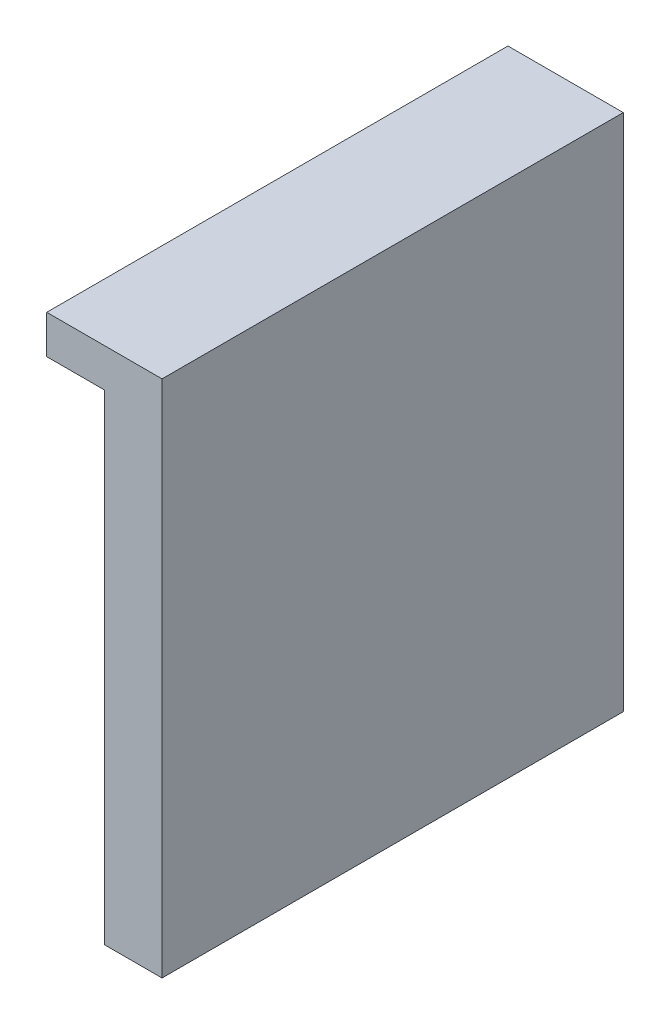
ISO-10303-21;
HEADER;
FILE_DESCRIPTION(('STEP AP214'),'2;1');
FILE_NAME('part.step','',(''),(''),'','','');
FILE_SCHEMA(('AUTOMOTIVE_DESIGN { 1 0 10303 214 1 1 1 1 }'));
ENDSEC;
DATA;
#1=APPLICATION_CONTEXT('core data for automotive mechanical design processes');
#2=APPLICATION_PROTOCOL_DEFINITION('international standard','automotive_design',2000,#1);
#3=PRODUCT_CONTEXT('',#1,'mechanical');
#4=PRODUCT('Part','Part','',(#3));
#5=PRODUCT_RELATED_PRODUCT_CATEGORY('part','',(#4));
#6=PRODUCT_DEFINITION_FORMATION('','',#4);
#7=PRODUCT_DEFINITION_CONTEXT('part definition',#1,'design');
#8=PRODUCT_DEFINITION('design','',#6,#7);
#9=PRODUCT_DEFINITION_SHAPE('','',#8);
#10=(LENGTH_UNIT() NAMED_UNIT(*) SI_UNIT(.MILLI.,.METRE.));
#11=(NAMED_UNIT(*) PLANE_ANGLE_UNIT() SI_UNIT($,.RADIAN.));
#12=(NAMED_UNIT(*) SI_UNIT($,.STERADIAN.) SOLID_ANGLE_UNIT());
#13=UNCERTAINTY_MEASURE_WITH_UNIT(LENGTH_MEASURE(1.E-05),#10,'distance_accuracy_value','');
#14=(GEOMETRIC_REPRESENTATION_CONTEXT(3) GLOBAL_UNCERTAINTY_ASSIGNED_CONTEXT((#13)) GLOBAL_UNIT_ASSIGNED_CONTEXT((#10,
#11,#12)) REPRESENTATION_CONTEXT('',''));
#15=CARTESIAN_POINT('',(0.,0.,0.));
#16=DIRECTION('',(0.,0.,1.));
#17=DIRECTION('',(1.,0.,0.));
#18=AXIS2_PLACEMENT_3D('',#15,#16,#17);
#19=CARTESIAN_POINT('',(0.,23.,-24.));
#20=DIRECTION('',(0.,0.,-1.));
#21=DIRECTION('',(-1.,0.,0.));
#22=AXIS2_PLACEMENT_3D('',#19,#20,#21);
#23=PLANE('',#22);
#24=DIRECTION('',(0.,-1.,0.));
#25=VECTOR('',#24,1.);
#26=CARTESIAN_POINT('',(3.,23.,-24.));
#27=LINE('',#26,#25);
#28=CARTESIAN_POINT('',(3.,25.,-24.));
#29=VERTEX_POINT('',#28);
#30=CARTESIAN_POINT('',(3.,-2.,-24.));
#31=VERTEX_POINT('',#30);
#32=EDGE_CURVE('E48',#29,#31,#27,.T.);
#33=ORIENTED_EDGE('',*,*,#32,.T.);
#34=DIRECTION('',(1.,0.,0.));
#35=VECTOR('',#34,1.);
#36=CARTESIAN_POINT('',(0.,-2.,-24.));
#37=LINE('',#36,#35);
#38=CARTESIAN_POINT('',(0.,-2.,-24.));
#39=VERTEX_POINT('',#38);
#40=EDGE_CURVE('E130',#39,#31,#37,.T.);
#41=ORIENTED_EDGE('',*,*,#40,.F.);
#42=DIRECTION('',(0.,-1.,0.));
#43=VECTOR('',#42,1.);
#44=CARTESIAN_POINT('',(0.,23.,-24.));
#45=LINE('',#44,#43);
#46=CARTESIAN_POINT('',(0.,23.,-24.));
#47=VERTEX_POINT('',#46);
#48=EDGE_CURVE('E11',#47,#39,#45,.T.);
#49=ORIENTED_EDGE('',*,*,#48,.F.);
#50=DIRECTION('',(-1.,0.,0.));
#51=VECTOR('',#50,1.);
#52=CARTESIAN_POINT('',(3.,23.,-24.));
#53=LINE('',#52,#51);
#54=CARTESIAN_POINT('',(-3.,23.,-24.));
#55=VERTEX_POINT('',#54);
#56=EDGE_CURVE('E69',#47,#55,#53,.T.);
#57=ORIENTED_EDGE('',*,*,#56,.T.);
#58=DIRECTION('',(0.,-1.,0.));
#59=VECTOR('',#58,1.);
#60=CARTESIAN_POINT('',(-3.,25.,-24.));
#61=LINE('',#60,#59);
#62=CARTESIAN_POINT('',(-3.,25.,-24.));
#63=VERTEX_POINT('',#62);
#64=EDGE_CURVE('E194',#63,#55,#61,.T.);
#65=ORIENTED_EDGE('',*,*,#64,.F.);
#66=DIRECTION('',(-1.,0.,0.));
#67=VECTOR('',#66,1.);
#68=CARTESIAN_POINT('',(3.,25.,-24.));
#69=LINE('',#68,#67);
#70=EDGE_CURVE('E175',#29,#63,#69,.T.);
#71=ORIENTED_EDGE('',*,*,#70,.F.);
#72=EDGE_LOOP('',(#33,#41,#49,#57,#65,#71));
#73=FACE_BOUND('',#72,.T.);
#74=ADVANCED_FACE('F45',(#73),#23,.T.);
#75=CARTESIAN_POINT('',(0.,23.,0.));
#76=DIRECTION('',(-1.,0.,0.));
#77=DIRECTION('',(0.,0.,1.));
#78=AXIS2_PLACEMENT_3D('',#75,#76,#77);
#79=PLANE('',#78);
#80=DIRECTION('',(0.,-1.,0.));
#81=VECTOR('',#80,1.);
#82=CARTESIAN_POINT('',(0.,12.,-23.));
#83=LINE('',#82,#81);
#84=CARTESIAN_POINT('',(0.,21.,-23.));
#85=VERTEX_POINT('',#84);
#86=CARTESIAN_POINT('',(0.,12.,-23.));
#87=VERTEX_POINT('',#86);
#88=EDGE_CURVE('E61',#85,#87,#83,.T.);
#89=ORIENTED_EDGE('',*,*,#88,.F.);
#90=DIRECTION('',(0.,0.,-1.));
#91=VECTOR('',#90,1.);
#92=CARTESIAN_POINT('',(0.,21.,-23.));
#93=LINE('',#92,#91);
#94=CARTESIAN_POINT('',(0.,21.,-1.));
#95=VERTEX_POINT('',#94);
#96=EDGE_CURVE('E149',#95,#85,#93,.T.);
#97=ORIENTED_EDGE('',*,*,#96,.F.);
#98=DIRECTION('',(0.,1.,0.));
#99=VECTOR('',#98,1.);
#100=CARTESIAN_POINT('',(0.,12.,-1.));
#101=LINE('',#100,#99);
#102=CARTESIAN_POINT('',(0.,12.,-1.));
#103=VERTEX_POINT('',#102);
#104=EDGE_CURVE('E163',#103,#95,#101,.T.);
#105=ORIENTED_EDGE('',*,*,#104,.F.);
#106=DIRECTION('',(0.,0.,1.));
#107=VECTOR('',#106,1.);
#108=CARTESIAN_POINT('',(0.,12.,-23.));
#109=LINE('',#108,#107);
#110=EDGE_CURVE('E160',#87,#103,#109,.T.);
#111=ORIENTED_EDGE('',*,*,#110,.F.);
#112=EDGE_LOOP('',(#89,#97,#105,#111));
#113=FACE_BOUND('',#112,.T.);
#114=ORIENTED_EDGE('',*,*,#48,.T.);
#115=DIRECTION('',(0.,0.,-1.));
#116=VECTOR('',#115,1.);
#117=CARTESIAN_POINT('',(0.,-2.,0.));
#118=LINE('',#117,#116);
#119=CARTESIAN_POINT('',(0.,-2.,0.));
#120=VERTEX_POINT('',#119);
#121=EDGE_CURVE('E126',#120,#39,#118,.T.);
#122=ORIENTED_EDGE('',*,*,#121,.F.);
#123=DIRECTION('',(0.,-1.,0.));
#124=VECTOR('',#123,1.);
#125=CARTESIAN_POINT('',(0.,23.,0.));
#126=LINE('',#125,#124);
#127=CARTESIAN_POINT('',(0.,23.,0.));
#128=VERTEX_POINT('',#127);
#129=EDGE_CURVE('E53',#128,#120,#126,.T.);
#130=ORIENTED_EDGE('',*,*,#129,.F.);
#131=DIRECTION('',(0.,0.,-1.));
#132=VECTOR('',#131,1.);
#133=CARTESIAN_POINT('',(0.,23.,0.));
#134=LINE('',#133,#132);
#135=EDGE_CURVE('E127',#128,#47,#134,.T.);
#136=ORIENTED_EDGE('',*,*,#135,.T.);
#137=EDGE_LOOP('',(#114,#122,#130,#136));
#138=FACE_BOUND('',#137,.T.);
#139=ADVANCED_FACE('F123',(#113,#138),#79,.T.);
#140=CARTESIAN_POINT('',(0.,23.,0.));
#141=DIRECTION('',(0.,0.,-1.));
#142=DIRECTION('',(-1.,0.,0.));
#143=AXIS2_PLACEMENT_3D('',#140,#141,#142);
#144=PLANE('',#143);
#145=ORIENTED_EDGE('',*,*,#129,.T.);
#146=DIRECTION('',(-1.,0.,0.));
#147=VECTOR('',#146,1.);
#148=CARTESIAN_POINT('',(0.,-2.,0.));
#149=LINE('',#148,#147);
#150=CARTESIAN_POINT('',(3.,-2.,0.));
#151=VERTEX_POINT('',#150);
#152=EDGE_CURVE('E140',#151,#120,#149,.T.);
#153=ORIENTED_EDGE('',*,*,#152,.F.);
#154=DIRECTION('',(0.,-1.,0.));
#155=VECTOR('',#154,1.);
#156=CARTESIAN_POINT('',(3.,23.,0.));
#157=LINE('',#156,#155);
#158=CARTESIAN_POINT('',(3.,25.,0.));
#159=VERTEX_POINT('',#158);
#160=EDGE_CURVE('E198',#159,#151,#157,.T.);
#161=ORIENTED_EDGE('',*,*,#160,.F.);
#162=DIRECTION('',(-1.,0.,0.));
#163=VECTOR('',#162,1.);
#164=CARTESIAN_POINT('',(3.,25.,0.));
#165=LINE('',#164,#163);
#166=CARTESIAN_POINT('',(-3.,25.,0.));
#167=VERTEX_POINT('',#166);
#168=EDGE_CURVE('E181',#159,#167,#165,.T.);
#169=ORIENTED_EDGE('',*,*,#168,.T.);
#170=DIRECTION('',(0.,-1.,0.));
#171=VECTOR('',#170,1.);
#172=CARTESIAN_POINT('',(-3.,25.,0.));
#173=LINE('',#172,#171);
#174=CARTESIAN_POINT('',(-3.,23.,0.));
#175=VERTEX_POINT('',#174);
#176=EDGE_CURVE('E187',#167,#175,#173,.T.);
#177=ORIENTED_EDGE('',*,*,#176,.T.);
#178=DIRECTION('',(-1.,0.,0.));
#179=VECTOR('',#178,1.);
#180=CARTESIAN_POINT('',(3.,23.,0.));
#181=LINE('',#180,#179);
#182=EDGE_CURVE('E178',#128,#175,#181,.T.);
#183=ORIENTED_EDGE('',*,*,#182,.F.);
#184=EDGE_LOOP('',(#145,#153,#161,#169,#177,#183));
#185=FACE_BOUND('',#184,.T.);
#186=ADVANCED_FACE('F204',(#185),#144,.F.);
#187=CARTESIAN_POINT('',(3.,23.,0.));
#188=DIRECTION('',(-1.,0.,0.));
#189=DIRECTION('',(0.,0.,1.));
#190=AXIS2_PLACEMENT_3D('',#187,#188,#189);
#191=PLANE('',#190);
#192=ORIENTED_EDGE('',*,*,#160,.T.);
#193=DIRECTION('',(0.,0.,1.));
#194=VECTOR('',#193,1.);
#195=CARTESIAN_POINT('',(3.,-2.,0.));
#196=LINE('',#195,#194);
#197=EDGE_CURVE('E135',#31,#151,#196,.T.);
#198=ORIENTED_EDGE('',*,*,#197,.F.);
#199=ORIENTED_EDGE('',*,*,#32,.F.);
#200=DIRECTION('',(0.,0.,-1.));
#201=VECTOR('',#200,1.);
#202=CARTESIAN_POINT('',(3.,25.,0.));
#203=LINE('',#202,#201);
#204=EDGE_CURVE('E184',#159,#29,#203,.T.);
#205=ORIENTED_EDGE('',*,*,#204,.F.);
#206=EDGE_LOOP('',(#192,#198,#199,#205));
#207=FACE_BOUND('',#206,.T.);
#208=ADVANCED_FACE('F201',(#207),#191,.F.);
#209=CARTESIAN_POINT('',(0.,23.,0.));
#210=DIRECTION('',(0.,-1.,0.));
#211=DIRECTION('',(0.,0.,-1.));
#212=AXIS2_PLACEMENT_3D('',#209,#210,#211);
#213=PLANE('',#212);
#214=ORIENTED_EDGE('',*,*,#135,.F.);
#215=ORIENTED_EDGE('',*,*,#182,.T.);
#216=DIRECTION('',(0.,0.,-1.));
#217=VECTOR('',#216,1.);
#218=CARTESIAN_POINT('',(-3.,23.,0.));
#219=LINE('',#218,#217);
#220=EDGE_CURVE('E189',#175,#55,#219,.T.);
#221=ORIENTED_EDGE('',*,*,#220,.T.);
#222=ORIENTED_EDGE('',*,*,#56,.F.);
#223=EDGE_LOOP('',(#214,#215,#221,#222));
#224=FACE_BOUND('',#223,.T.);
#225=ADVANCED_FACE('F207',(#224),#213,.T.);
#226=CARTESIAN_POINT('',(-3.,25.,0.));
#227=DIRECTION('',(-1.,0.,0.));
#228=DIRECTION('',(0.,0.,1.));
#229=AXIS2_PLACEMENT_3D('',#226,#227,#228);
#230=PLANE('',#229);
#231=ORIENTED_EDGE('',*,*,#220,.F.);
#232=ORIENTED_EDGE('',*,*,#176,.F.);
#233=DIRECTION('',(0.,0.,-1.));
#234=VECTOR('',#233,1.);
#235=CARTESIAN_POINT('',(-3.,25.,0.));
#236=LINE('',#235,#234);
#237=EDGE_CURVE('E177',#167,#63,#236,.T.);
#238=ORIENTED_EDGE('',*,*,#237,.T.);
#239=ORIENTED_EDGE('',*,*,#64,.T.);
#240=EDGE_LOOP('',(#231,#232,#238,#239));
#241=FACE_BOUND('',#240,.T.);
#242=ADVANCED_FACE('F209',(#241),#230,.T.);
#243=CARTESIAN_POINT('',(0.,25.,0.));
#244=DIRECTION('',(0.,-1.,0.));
#245=DIRECTION('',(0.,0.,-1.));
#246=AXIS2_PLACEMENT_3D('',#243,#244,#245);
#247=PLANE('',#246);
#248=ORIENTED_EDGE('',*,*,#70,.T.);
#249=ORIENTED_EDGE('',*,*,#237,.F.);
#250=ORIENTED_EDGE('',*,*,#168,.F.);
#251=ORIENTED_EDGE('',*,*,#204,.T.);
#252=EDGE_LOOP('',(#248,#249,#250,#251));
#253=FACE_BOUND('',#252,.T.);
#254=ADVANCED_FACE('F213',(#253),#247,.F.);
#255=CARTESIAN_POINT('',(0.999999999999995,12.,-23.));
#256=DIRECTION('',(0.,0.,-1.));
#257=DIRECTION('',(-1.,0.,0.));
#258=AXIS2_PLACEMENT_3D('',#255,#256,#257);
#259=PLANE('',#258);
#260=ORIENTED_EDGE('',*,*,#88,.T.);
#261=DIRECTION('',(-1.,0.,0.));
#262=VECTOR('',#261,1.);
#263=CARTESIAN_POINT('',(0.999999999999995,12.,-23.));
#264=LINE('',#263,#262);
#265=CARTESIAN_POINT('',(0.999999999999995,12.,-23.));
#266=VERTEX_POINT('',#265);
#267=EDGE_CURVE('E158',#266,#87,#264,.T.);
#268=ORIENTED_EDGE('',*,*,#267,.F.);
#269=DIRECTION('',(0.,-1.,0.));
#270=VECTOR('',#269,1.);
#271=CARTESIAN_POINT('',(0.999999999999995,12.,-23.));
#272=LINE('',#271,#270);
#273=CARTESIAN_POINT('',(0.999999999999995,21.,-23.));
#274=VERTEX_POINT('',#273);
#275=EDGE_CURVE('E145',#274,#266,#272,.T.);
#276=ORIENTED_EDGE('',*,*,#275,.F.);
#277=DIRECTION('',(-1.,0.,0.));
#278=VECTOR('',#277,1.);
#279=CARTESIAN_POINT('',(0.999999999999995,21.,-23.));
#280=LINE('',#279,#278);
#281=EDGE_CURVE('E168',#274,#85,#280,.T.);
#282=ORIENTED_EDGE('',*,*,#281,.T.);
#283=EDGE_LOOP('',(#260,#268,#276,#282));
#284=FACE_BOUND('',#283,.T.);
#285=ADVANCED_FACE('F215',(#284),#259,.F.);
#286=CARTESIAN_POINT('',(0.999999999999995,21.,-23.));
#287=DIRECTION('',(0.,1.,0.));
#288=DIRECTION('',(0.,0.,1.));
#289=AXIS2_PLACEMENT_3D('',#286,#287,#288);
#290=PLANE('',#289);
#291=ORIENTED_EDGE('',*,*,#96,.T.);
#292=ORIENTED_EDGE('',*,*,#281,.F.);
#293=DIRECTION('',(0.,0.,-1.));
#294=VECTOR('',#293,1.);
#295=CARTESIAN_POINT('',(0.999999999999995,21.,-23.));
#296=LINE('',#295,#294);
#297=CARTESIAN_POINT('',(1.,21.,-1.));
#298=VERTEX_POINT('',#297);
#299=EDGE_CURVE('E155',#298,#274,#296,.T.);
#300=ORIENTED_EDGE('',*,*,#299,.F.);
#301=DIRECTION('',(-1.,0.,0.));
#302=VECTOR('',#301,1.);
#303=CARTESIAN_POINT('',(1.,21.,-1.));
#304=LINE('',#303,#302);
#305=EDGE_CURVE('E170',#298,#95,#304,.T.);
#306=ORIENTED_EDGE('',*,*,#305,.T.);
#307=EDGE_LOOP('',(#291,#292,#300,#306));
#308=FACE_BOUND('',#307,.T.);
#309=ADVANCED_FACE('F221',(#308),#290,.F.);
#310=CARTESIAN_POINT('',(1.,12.,-1.));
#311=DIRECTION('',(0.,0.,1.));
#312=DIRECTION('',(1.,0.,0.));
#313=AXIS2_PLACEMENT_3D('',#310,#311,#312);
#314=PLANE('',#313);
#315=ORIENTED_EDGE('',*,*,#104,.T.);
#316=ORIENTED_EDGE('',*,*,#305,.F.);
#317=DIRECTION('',(0.,1.,0.));
#318=VECTOR('',#317,1.);
#319=CARTESIAN_POINT('',(1.,12.,-1.));
#320=LINE('',#319,#318);
#321=CARTESIAN_POINT('',(1.,12.,-1.));
#322=VERTEX_POINT('',#321);
#323=EDGE_CURVE('E152',#322,#298,#320,.T.);
#324=ORIENTED_EDGE('',*,*,#323,.F.);
#325=DIRECTION('',(-1.,0.,0.));
#326=VECTOR('',#325,1.);
#327=CARTESIAN_POINT('',(1.,12.,-1.));
#328=LINE('',#327,#326);
#329=EDGE_CURVE('E172',#322,#103,#328,.T.);
#330=ORIENTED_EDGE('',*,*,#329,.T.);
#331=EDGE_LOOP('',(#315,#316,#324,#330));
#332=FACE_BOUND('',#331,.T.);
#333=ADVANCED_FACE('F269',(#332),#314,.F.);
#334=CARTESIAN_POINT('',(0.999999999999995,12.,-23.));
#335=DIRECTION('',(0.,-1.,0.));
#336=DIRECTION('',(0.,0.,-1.));
#337=AXIS2_PLACEMENT_3D('',#334,#335,#336);
#338=PLANE('',#337);
#339=ORIENTED_EDGE('',*,*,#110,.T.);
#340=ORIENTED_EDGE('',*,*,#329,.F.);
#341=DIRECTION('',(0.,0.,1.));
#342=VECTOR('',#341,1.);
#343=CARTESIAN_POINT('',(0.999999999999995,12.,-23.));
#344=LINE('',#343,#342);
#345=EDGE_CURVE('E148',#266,#322,#344,.T.);
#346=ORIENTED_EDGE('',*,*,#345,.F.);
#347=ORIENTED_EDGE('',*,*,#267,.T.);
#348=EDGE_LOOP('',(#339,#340,#346,#347));
#349=FACE_BOUND('',#348,.T.);
#350=ADVANCED_FACE('F279',(#349),#338,.F.);
#351=CARTESIAN_POINT('',(1.,0.,0.));
#352=DIRECTION('',(1.,0.,0.));
#353=DIRECTION('',(0.,0.,-1.));
#354=AXIS2_PLACEMENT_3D('',#351,#352,#353);
#355=PLANE('',#354);
#356=ORIENTED_EDGE('',*,*,#275,.T.);
#357=ORIENTED_EDGE('',*,*,#345,.T.);
#358=ORIENTED_EDGE('',*,*,#323,.T.);
#359=ORIENTED_EDGE('',*,*,#299,.T.);
#360=EDGE_LOOP('',(#356,#357,#358,#359));
#361=FACE_BOUND('',#360,.T.);
#362=ADVANCED_FACE('F289',(#361),#355,.F.);
#363=CARTESIAN_POINT('',(0.,-2.,0.));
#364=DIRECTION('',(0.,-1.,0.));
#365=DIRECTION('',(0.,0.,-1.));
#366=AXIS2_PLACEMENT_3D('',#363,#364,#365);
#367=PLANE('',#366);
#368=ORIENTED_EDGE('',*,*,#121,.T.);
#369=ORIENTED_EDGE('',*,*,#40,.T.);
#370=ORIENTED_EDGE('',*,*,#197,.T.);
#371=ORIENTED_EDGE('',*,*,#152,.T.);
#372=EDGE_LOOP('',(#368,#369,#370,#371));
#373=FACE_BOUND('',#372,.T.);
#374=ADVANCED_FACE('F138',(#373),#367,.T.);
#375=CLOSED_SHELL('',(#74,#139,#186,#208,#225,#242,#254,#285,#309,#333,#350,#362,#374));
#376=MANIFOLD_SOLID_BREP('B2',#375);
#377=ADVANCED_BREP_SHAPE_REPRESENTATION('',(#18,#376),#14);
#378=SHAPE_DEFINITION_REPRESENTATION(#9,#377);
ENDSEC;
END-ISO-10303-21;
